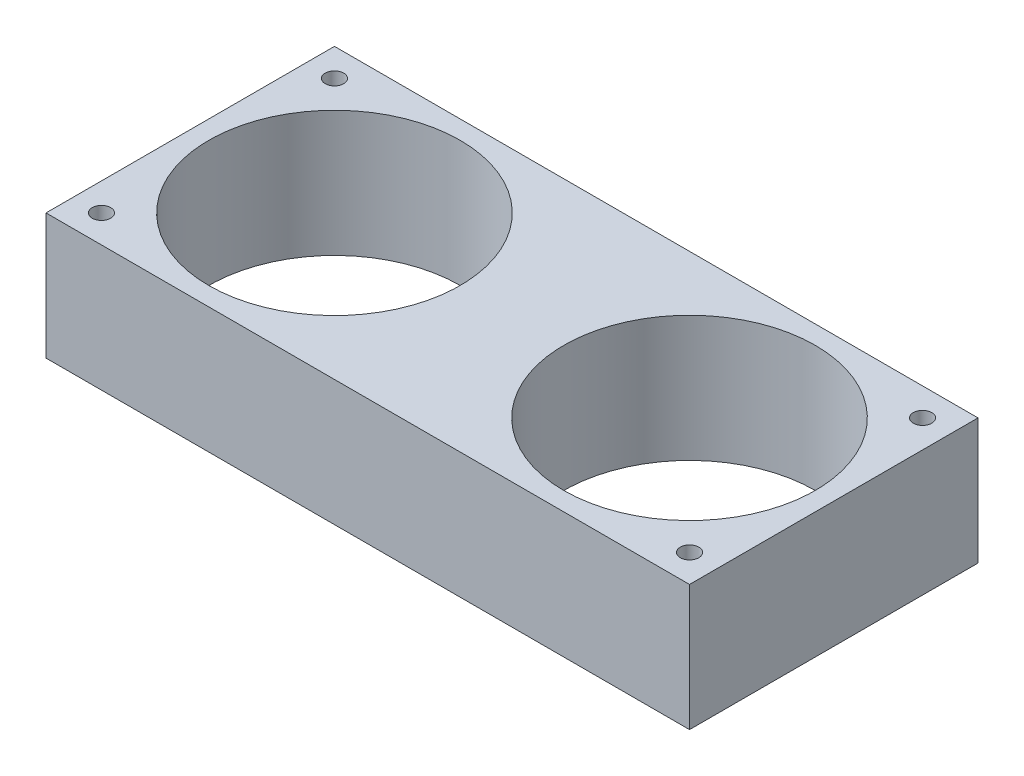
ISO-10303-21;
HEADER;
FILE_DESCRIPTION(('STEP AP214'),'2;1');
FILE_NAME('part.step','',(''),(''),'','','');
FILE_SCHEMA(('AUTOMOTIVE_DESIGN { 1 0 10303 214 1 1 1 1 }'));
ENDSEC;
DATA;
#1=APPLICATION_CONTEXT('core data for automotive mechanical design processes');
#2=APPLICATION_PROTOCOL_DEFINITION('international standard','automotive_design',2000,#1);
#3=PRODUCT_CONTEXT('',#1,'mechanical');
#4=PRODUCT('Part','Part','',(#3));
#5=PRODUCT_RELATED_PRODUCT_CATEGORY('part','',(#4));
#6=PRODUCT_DEFINITION_FORMATION('','',#4);
#7=PRODUCT_DEFINITION_CONTEXT('part definition',#1,'design');
#8=PRODUCT_DEFINITION('design','',#6,#7);
#9=PRODUCT_DEFINITION_SHAPE('','',#8);
#10=(LENGTH_UNIT() NAMED_UNIT(*) SI_UNIT(.MILLI.,.METRE.));
#11=(NAMED_UNIT(*) PLANE_ANGLE_UNIT() SI_UNIT($,.RADIAN.));
#12=(NAMED_UNIT(*) SI_UNIT($,.STERADIAN.) SOLID_ANGLE_UNIT());
#13=UNCERTAINTY_MEASURE_WITH_UNIT(LENGTH_MEASURE(1.E-05),#10,'distance_accuracy_value','');
#14=(GEOMETRIC_REPRESENTATION_CONTEXT(3) GLOBAL_UNCERTAINTY_ASSIGNED_CONTEXT((#13)) GLOBAL_UNIT_ASSIGNED_CONTEXT((#10,
#11,#12)) REPRESENTATION_CONTEXT('',''));
#15=CARTESIAN_POINT('',(0.,0.,0.));
#16=DIRECTION('',(0.,0.,1.));
#17=DIRECTION('',(1.,0.,0.));
#18=AXIS2_PLACEMENT_3D('',#15,#16,#17);
#19=CARTESIAN_POINT('',(0.,34.,0.));
#20=DIRECTION('',(0.,-1.,0.));
#21=DIRECTION('',(0.,0.,-1.));
#22=AXIS2_PLACEMENT_3D('',#19,#20,#21);
#23=PLANE('',#22);
#24=DIRECTION('',(0.,0.,1.));
#25=VECTOR('',#24,1.);
#26=CARTESIAN_POINT('',(-87.,34.,39.));
#27=LINE('',#26,#25);
#28=CARTESIAN_POINT('',(-87.,34.,-39.));
#29=VERTEX_POINT('',#28);
#30=CARTESIAN_POINT('',(-87.,34.,39.));
#31=VERTEX_POINT('',#30);
#32=EDGE_CURVE('E85',#29,#31,#27,.T.);
#33=ORIENTED_EDGE('',*,*,#32,.T.);
#34=DIRECTION('',(1.,0.,0.));
#35=VECTOR('',#34,1.);
#36=CARTESIAN_POINT('',(-87.,34.,39.));
#37=LINE('',#36,#35);
#38=CARTESIAN_POINT('',(87.,34.,39.));
#39=VERTEX_POINT('',#38);
#40=EDGE_CURVE('E80',#31,#39,#37,.T.);
#41=ORIENTED_EDGE('',*,*,#40,.T.);
#42=DIRECTION('',(0.,0.,-1.));
#43=VECTOR('',#42,1.);
#44=CARTESIAN_POINT('',(87.,34.,39.));
#45=LINE('',#44,#43);
#46=CARTESIAN_POINT('',(87.,34.,-39.));
#47=VERTEX_POINT('',#46);
#48=EDGE_CURVE('E83',#39,#47,#45,.T.);
#49=ORIENTED_EDGE('',*,*,#48,.T.);
#50=DIRECTION('',(-1.,0.,0.));
#51=VECTOR('',#50,1.);
#52=CARTESIAN_POINT('',(-87.,34.,-39.));
#53=LINE('',#52,#51);
#54=EDGE_CURVE('E50',#47,#29,#53,.T.);
#55=ORIENTED_EDGE('',*,*,#54,.T.);
#56=EDGE_LOOP('',(#33,#41,#49,#55));
#57=FACE_BOUND('',#56,.T.);
#58=CARTESIAN_POINT('',(-48.,34.,0.));
#59=DIRECTION('',(0.,1.,0.));
#60=DIRECTION('',(0.,0.,1.));
#61=AXIS2_PLACEMENT_3D('',#58,#59,#60);
#62=CIRCLE('',#61,34.);
#63=CARTESIAN_POINT('',(-48.,34.,34.));
#64=VERTEX_POINT('',#63);
#65=EDGE_CURVE('E100',#64,#64,#62,.T.);
#66=ORIENTED_EDGE('',*,*,#65,.F.);
#67=EDGE_LOOP('',(#66));
#68=FACE_BOUND('',#67,.T.);
#69=CARTESIAN_POINT('',(48.,34.,0.));
#70=DIRECTION('',(0.,1.,0.));
#71=DIRECTION('',(0.,0.,1.));
#72=AXIS2_PLACEMENT_3D('',#69,#70,#71);
#73=CIRCLE('',#72,34.);
#74=CARTESIAN_POINT('',(48.,34.,34.));
#75=VERTEX_POINT('',#74);
#76=EDGE_CURVE('E115',#75,#75,#73,.T.);
#77=ORIENTED_EDGE('',*,*,#76,.F.);
#78=EDGE_LOOP('',(#77));
#79=FACE_BOUND('',#78,.T.);
#80=CARTESIAN_POINT('',(-79.5,34.,-31.5));
#81=DIRECTION('',(0.,1.,0.));
#82=DIRECTION('',(0.,0.,1.));
#83=AXIS2_PLACEMENT_3D('',#80,#81,#82);
#84=CIRCLE('',#83,2.5);
#85=CARTESIAN_POINT('',(-79.5,34.,-29.));
#86=VERTEX_POINT('',#85);
#87=EDGE_CURVE('E121',#86,#86,#84,.T.);
#88=ORIENTED_EDGE('',*,*,#87,.F.);
#89=EDGE_LOOP('',(#88));
#90=FACE_BOUND('',#89,.T.);
#91=CARTESIAN_POINT('',(-79.5,34.,31.5));
#92=DIRECTION('',(0.,1.,0.));
#93=DIRECTION('',(0.,0.,1.));
#94=AXIS2_PLACEMENT_3D('',#91,#92,#93);
#95=CIRCLE('',#94,2.5);
#96=CARTESIAN_POINT('',(-79.5,34.,34.));
#97=VERTEX_POINT('',#96);
#98=EDGE_CURVE('E127',#97,#97,#95,.T.);
#99=ORIENTED_EDGE('',*,*,#98,.F.);
#100=EDGE_LOOP('',(#99));
#101=FACE_BOUND('',#100,.T.);
#102=CARTESIAN_POINT('',(79.5,34.,31.5));
#103=DIRECTION('',(0.,1.,0.));
#104=DIRECTION('',(0.,0.,1.));
#105=AXIS2_PLACEMENT_3D('',#102,#103,#104);
#106=CIRCLE('',#105,2.5);
#107=CARTESIAN_POINT('',(79.5,34.,34.));
#108=VERTEX_POINT('',#107);
#109=EDGE_CURVE('E133',#108,#108,#106,.T.);
#110=ORIENTED_EDGE('',*,*,#109,.F.);
#111=EDGE_LOOP('',(#110));
#112=FACE_BOUND('',#111,.T.);
#113=CARTESIAN_POINT('',(79.5,34.,-31.5));
#114=DIRECTION('',(0.,1.,0.));
#115=DIRECTION('',(0.,0.,1.));
#116=AXIS2_PLACEMENT_3D('',#113,#114,#115);
#117=CIRCLE('',#116,2.5);
#118=CARTESIAN_POINT('',(79.5,34.,-29.));
#119=VERTEX_POINT('',#118);
#120=EDGE_CURVE('E139',#119,#119,#117,.T.);
#121=ORIENTED_EDGE('',*,*,#120,.F.);
#122=EDGE_LOOP('',(#121));
#123=FACE_BOUND('',#122,.T.);
#124=ADVANCED_FACE('F33',(#57,#68,#79,#90,#101,#112,#123),#23,.F.);
#125=CARTESIAN_POINT('',(0.,0.,0.));
#126=DIRECTION('',(0.,-1.,0.));
#127=DIRECTION('',(0.,0.,-1.));
#128=AXIS2_PLACEMENT_3D('',#125,#126,#127);
#129=PLANE('',#128);
#130=CARTESIAN_POINT('',(79.5,0.,31.5));
#131=DIRECTION('',(0.,1.,0.));
#132=DIRECTION('',(0.,0.,1.));
#133=AXIS2_PLACEMENT_3D('',#130,#131,#132);
#134=CIRCLE('',#133,2.5);
#135=CARTESIAN_POINT('',(79.5,0.,34.));
#136=VERTEX_POINT('',#135);
#137=EDGE_CURVE('E136',#136,#136,#134,.T.);
#138=ORIENTED_EDGE('',*,*,#137,.T.);
#139=EDGE_LOOP('',(#138));
#140=FACE_BOUND('',#139,.T.);
#141=CARTESIAN_POINT('',(-79.5,0.,-31.5));
#142=DIRECTION('',(0.,1.,0.));
#143=DIRECTION('',(0.,0.,1.));
#144=AXIS2_PLACEMENT_3D('',#141,#142,#143);
#145=CIRCLE('',#144,2.5);
#146=CARTESIAN_POINT('',(-79.5,0.,-29.));
#147=VERTEX_POINT('',#146);
#148=EDGE_CURVE('E124',#147,#147,#145,.T.);
#149=ORIENTED_EDGE('',*,*,#148,.T.);
#150=EDGE_LOOP('',(#149));
#151=FACE_BOUND('',#150,.T.);
#152=CARTESIAN_POINT('',(-48.,0.,0.));
#153=DIRECTION('',(0.,1.,0.));
#154=DIRECTION('',(0.,0.,1.));
#155=AXIS2_PLACEMENT_3D('',#152,#153,#154);
#156=CIRCLE('',#155,34.);
#157=CARTESIAN_POINT('',(-48.,0.,34.));
#158=VERTEX_POINT('',#157);
#159=EDGE_CURVE('E112',#158,#158,#156,.T.);
#160=ORIENTED_EDGE('',*,*,#159,.T.);
#161=EDGE_LOOP('',(#160));
#162=FACE_BOUND('',#161,.T.);
#163=DIRECTION('',(0.,0.,1.));
#164=VECTOR('',#163,1.);
#165=CARTESIAN_POINT('',(-87.,0.,39.));
#166=LINE('',#165,#164);
#167=CARTESIAN_POINT('',(-87.,0.,-39.));
#168=VERTEX_POINT('',#167);
#169=CARTESIAN_POINT('',(-87.,0.,39.));
#170=VERTEX_POINT('',#169);
#171=EDGE_CURVE('E97',#168,#170,#166,.T.);
#172=ORIENTED_EDGE('',*,*,#171,.F.);
#173=DIRECTION('',(-1.,0.,0.));
#174=VECTOR('',#173,1.);
#175=CARTESIAN_POINT('',(-87.,0.,-39.));
#176=LINE('',#175,#174);
#177=CARTESIAN_POINT('',(87.,0.,-39.));
#178=VERTEX_POINT('',#177);
#179=EDGE_CURVE('E73',#178,#168,#176,.T.);
#180=ORIENTED_EDGE('',*,*,#179,.F.);
#181=DIRECTION('',(0.,0.,-1.));
#182=VECTOR('',#181,1.);
#183=CARTESIAN_POINT('',(87.,0.,39.));
#184=LINE('',#183,#182);
#185=CARTESIAN_POINT('',(87.,0.,39.));
#186=VERTEX_POINT('',#185);
#187=EDGE_CURVE('E67',#186,#178,#184,.T.);
#188=ORIENTED_EDGE('',*,*,#187,.F.);
#189=DIRECTION('',(1.,0.,0.));
#190=VECTOR('',#189,1.);
#191=CARTESIAN_POINT('',(-87.,0.,39.));
#192=LINE('',#191,#190);
#193=EDGE_CURVE('E89',#170,#186,#192,.T.);
#194=ORIENTED_EDGE('',*,*,#193,.F.);
#195=EDGE_LOOP('',(#172,#180,#188,#194));
#196=FACE_BOUND('',#195,.T.);
#197=CARTESIAN_POINT('',(48.,0.,0.));
#198=DIRECTION('',(0.,1.,0.));
#199=DIRECTION('',(0.,0.,1.));
#200=AXIS2_PLACEMENT_3D('',#197,#198,#199);
#201=CIRCLE('',#200,34.);
#202=CARTESIAN_POINT('',(48.,0.,34.));
#203=VERTEX_POINT('',#202);
#204=EDGE_CURVE('E118',#203,#203,#201,.T.);
#205=ORIENTED_EDGE('',*,*,#204,.T.);
#206=EDGE_LOOP('',(#205));
#207=FACE_BOUND('',#206,.T.);
#208=CARTESIAN_POINT('',(-79.5,0.,31.5));
#209=DIRECTION('',(0.,1.,0.));
#210=DIRECTION('',(0.,0.,1.));
#211=AXIS2_PLACEMENT_3D('',#208,#209,#210);
#212=CIRCLE('',#211,2.5);
#213=CARTESIAN_POINT('',(-79.5,0.,34.));
#214=VERTEX_POINT('',#213);
#215=EDGE_CURVE('E130',#214,#214,#212,.T.);
#216=ORIENTED_EDGE('',*,*,#215,.T.);
#217=EDGE_LOOP('',(#216));
#218=FACE_BOUND('',#217,.T.);
#219=CARTESIAN_POINT('',(79.5,0.,-31.5));
#220=DIRECTION('',(0.,1.,0.));
#221=DIRECTION('',(0.,0.,1.));
#222=AXIS2_PLACEMENT_3D('',#219,#220,#221);
#223=CIRCLE('',#222,2.5);
#224=CARTESIAN_POINT('',(79.5,0.,-29.));
#225=VERTEX_POINT('',#224);
#226=EDGE_CURVE('E142',#225,#225,#223,.T.);
#227=ORIENTED_EDGE('',*,*,#226,.T.);
#228=EDGE_LOOP('',(#227));
#229=FACE_BOUND('',#228,.T.);
#230=ADVANCED_FACE('F108',(#140,#151,#162,#196,#207,#218,#229),#129,.T.);
#231=CARTESIAN_POINT('',(-87.,34.,39.));
#232=DIRECTION('',(1.,0.,0.));
#233=DIRECTION('',(0.,0.,-1.));
#234=AXIS2_PLACEMENT_3D('',#231,#232,#233);
#235=PLANE('',#234);
#236=ORIENTED_EDGE('',*,*,#171,.T.);
#237=DIRECTION('',(0.,-1.,0.));
#238=VECTOR('',#237,1.);
#239=CARTESIAN_POINT('',(-87.,34.,39.));
#240=LINE('',#239,#238);
#241=EDGE_CURVE('E11',#31,#170,#240,.T.);
#242=ORIENTED_EDGE('',*,*,#241,.F.);
#243=ORIENTED_EDGE('',*,*,#32,.F.);
#244=DIRECTION('',(0.,-1.,0.));
#245=VECTOR('',#244,1.);
#246=CARTESIAN_POINT('',(-87.,34.,-39.));
#247=LINE('',#246,#245);
#248=EDGE_CURVE('E93',#29,#168,#247,.T.);
#249=ORIENTED_EDGE('',*,*,#248,.T.);
#250=EDGE_LOOP('',(#236,#242,#243,#249));
#251=FACE_BOUND('',#250,.T.);
#252=ADVANCED_FACE('F35',(#251),#235,.F.);
#253=CARTESIAN_POINT('',(-87.,34.,39.));
#254=DIRECTION('',(0.,0.,-1.));
#255=DIRECTION('',(-1.,0.,0.));
#256=AXIS2_PLACEMENT_3D('',#253,#254,#255);
#257=PLANE('',#256);
#258=ORIENTED_EDGE('',*,*,#193,.T.);
#259=DIRECTION('',(0.,-1.,0.));
#260=VECTOR('',#259,1.);
#261=CARTESIAN_POINT('',(87.,34.,39.));
#262=LINE('',#261,#260);
#263=EDGE_CURVE('E42',#39,#186,#262,.T.);
#264=ORIENTED_EDGE('',*,*,#263,.F.);
#265=ORIENTED_EDGE('',*,*,#40,.F.);
#266=ORIENTED_EDGE('',*,*,#241,.T.);
#267=EDGE_LOOP('',(#258,#264,#265,#266));
#268=FACE_BOUND('',#267,.T.);
#269=ADVANCED_FACE('F88',(#268),#257,.F.);
#270=CARTESIAN_POINT('',(87.,34.,39.));
#271=DIRECTION('',(-1.,0.,0.));
#272=DIRECTION('',(0.,0.,1.));
#273=AXIS2_PLACEMENT_3D('',#270,#271,#272);
#274=PLANE('',#273);
#275=ORIENTED_EDGE('',*,*,#187,.T.);
#276=DIRECTION('',(0.,-1.,0.));
#277=VECTOR('',#276,1.);
#278=CARTESIAN_POINT('',(87.,34.,-39.));
#279=LINE('',#278,#277);
#280=EDGE_CURVE('E90',#47,#178,#279,.T.);
#281=ORIENTED_EDGE('',*,*,#280,.F.);
#282=ORIENTED_EDGE('',*,*,#48,.F.);
#283=ORIENTED_EDGE('',*,*,#263,.T.);
#284=EDGE_LOOP('',(#275,#281,#282,#283));
#285=FACE_BOUND('',#284,.T.);
#286=ADVANCED_FACE('F91',(#285),#274,.F.);
#287=CARTESIAN_POINT('',(-87.,34.,-39.));
#288=DIRECTION('',(0.,0.,1.));
#289=DIRECTION('',(1.,0.,0.));
#290=AXIS2_PLACEMENT_3D('',#287,#288,#289);
#291=PLANE('',#290);
#292=ORIENTED_EDGE('',*,*,#179,.T.);
#293=ORIENTED_EDGE('',*,*,#248,.F.);
#294=ORIENTED_EDGE('',*,*,#54,.F.);
#295=ORIENTED_EDGE('',*,*,#280,.T.);
#296=EDGE_LOOP('',(#292,#293,#294,#295));
#297=FACE_BOUND('',#296,.T.);
#298=ADVANCED_FACE('F105',(#297),#291,.F.);
#299=CARTESIAN_POINT('',(-48.,34.,0.));
#300=DIRECTION('',(0.,-1.,0.));
#301=DIRECTION('',(0.,0.,-1.));
#302=AXIS2_PLACEMENT_3D('',#299,#300,#301);
#303=CYLINDRICAL_SURFACE('',#302,34.);
#304=ORIENTED_EDGE('',*,*,#65,.T.);
#305=EDGE_LOOP('',(#304));
#306=FACE_BOUND('',#305,.T.);
#307=ORIENTED_EDGE('',*,*,#159,.F.);
#308=EDGE_LOOP('',(#307));
#309=FACE_BOUND('',#308,.T.);
#310=ADVANCED_FACE('F159',(#306,#309),#303,.F.);
#311=CARTESIAN_POINT('',(48.,34.,0.));
#312=DIRECTION('',(0.,-1.,0.));
#313=DIRECTION('',(0.,0.,-1.));
#314=AXIS2_PLACEMENT_3D('',#311,#312,#313);
#315=CYLINDRICAL_SURFACE('',#314,34.);
#316=ORIENTED_EDGE('',*,*,#76,.T.);
#317=EDGE_LOOP('',(#316));
#318=FACE_BOUND('',#317,.T.);
#319=ORIENTED_EDGE('',*,*,#204,.F.);
#320=EDGE_LOOP('',(#319));
#321=FACE_BOUND('',#320,.T.);
#322=ADVANCED_FACE('F205',(#318,#321),#315,.F.);
#323=CARTESIAN_POINT('',(-79.5,34.,-31.5));
#324=DIRECTION('',(0.,-1.,0.));
#325=DIRECTION('',(0.,0.,-1.));
#326=AXIS2_PLACEMENT_3D('',#323,#324,#325);
#327=CYLINDRICAL_SURFACE('',#326,2.5);
#328=ORIENTED_EDGE('',*,*,#87,.T.);
#329=EDGE_LOOP('',(#328));
#330=FACE_BOUND('',#329,.T.);
#331=ORIENTED_EDGE('',*,*,#148,.F.);
#332=EDGE_LOOP('',(#331));
#333=FACE_BOUND('',#332,.T.);
#334=ADVANCED_FACE('F213',(#330,#333),#327,.F.);
#335=CARTESIAN_POINT('',(-79.5,34.,31.5));
#336=DIRECTION('',(0.,-1.,0.));
#337=DIRECTION('',(0.,0.,-1.));
#338=AXIS2_PLACEMENT_3D('',#335,#336,#337);
#339=CYLINDRICAL_SURFACE('',#338,2.5);
#340=ORIENTED_EDGE('',*,*,#98,.T.);
#341=EDGE_LOOP('',(#340));
#342=FACE_BOUND('',#341,.T.);
#343=ORIENTED_EDGE('',*,*,#215,.F.);
#344=EDGE_LOOP('',(#343));
#345=FACE_BOUND('',#344,.T.);
#346=ADVANCED_FACE('F221',(#342,#345),#339,.F.);
#347=CARTESIAN_POINT('',(79.5,34.,31.5));
#348=DIRECTION('',(0.,-1.,0.));
#349=DIRECTION('',(0.,0.,-1.));
#350=AXIS2_PLACEMENT_3D('',#347,#348,#349);
#351=CYLINDRICAL_SURFACE('',#350,2.5);
#352=ORIENTED_EDGE('',*,*,#109,.T.);
#353=EDGE_LOOP('',(#352));
#354=FACE_BOUND('',#353,.T.);
#355=ORIENTED_EDGE('',*,*,#137,.F.);
#356=EDGE_LOOP('',(#355));
#357=FACE_BOUND('',#356,.T.);
#358=ADVANCED_FACE('F230',(#354,#357),#351,.F.);
#359=CARTESIAN_POINT('',(79.5,34.,-31.5));
#360=DIRECTION('',(0.,-1.,0.));
#361=DIRECTION('',(0.,0.,-1.));
#362=AXIS2_PLACEMENT_3D('',#359,#360,#361);
#363=CYLINDRICAL_SURFACE('',#362,2.5);
#364=ORIENTED_EDGE('',*,*,#120,.T.);
#365=EDGE_LOOP('',(#364));
#366=FACE_BOUND('',#365,.T.);
#367=ORIENTED_EDGE('',*,*,#226,.F.);
#368=EDGE_LOOP('',(#367));
#369=FACE_BOUND('',#368,.T.);
#370=ADVANCED_FACE('F148',(#366,#369),#363,.F.);
#371=CLOSED_SHELL('',(#124,#230,#252,#269,#286,#298,#310,#322,#334,#346,#358,#370));
#372=MANIFOLD_SOLID_BREP('B2',#371);
#373=ADVANCED_BREP_SHAPE_REPRESENTATION('',(#18,#372),#14);
#374=SHAPE_DEFINITION_REPRESENTATION(#9,#373);
ENDSEC;
END-ISO-10303-21;
